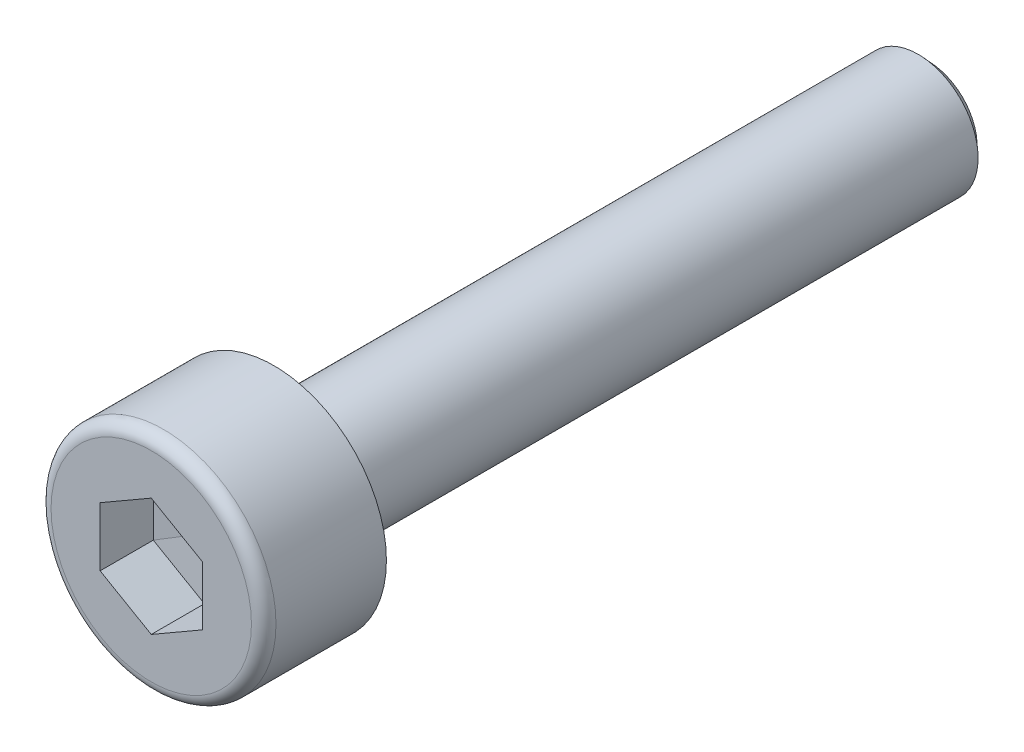
ISO-10303-21;
HEADER;
FILE_DESCRIPTION(('STEP AP214'),'2;1');
FILE_NAME('part.step','',(''),(''),'','','');
FILE_SCHEMA(('AUTOMOTIVE_DESIGN { 1 0 10303 214 1 1 1 1 }'));
ENDSEC;
DATA;
#1=APPLICATION_CONTEXT('core data for automotive mechanical design processes');
#2=APPLICATION_PROTOCOL_DEFINITION('international standard','automotive_design',2000,#1);
#3=PRODUCT_CONTEXT('',#1,'mechanical');
#4=PRODUCT('Part','Part','',(#3));
#5=PRODUCT_RELATED_PRODUCT_CATEGORY('part','',(#4));
#6=PRODUCT_DEFINITION_FORMATION('','',#4);
#7=PRODUCT_DEFINITION_CONTEXT('part definition',#1,'design');
#8=PRODUCT_DEFINITION('design','',#6,#7);
#9=PRODUCT_DEFINITION_SHAPE('','',#8);
#10=(LENGTH_UNIT() NAMED_UNIT(*) SI_UNIT(.MILLI.,.METRE.));
#11=(NAMED_UNIT(*) PLANE_ANGLE_UNIT() SI_UNIT($,.RADIAN.));
#12=(NAMED_UNIT(*) SI_UNIT($,.STERADIAN.) SOLID_ANGLE_UNIT());
#13=UNCERTAINTY_MEASURE_WITH_UNIT(LENGTH_MEASURE(1.E-05),#10,'distance_accuracy_value','');
#14=(GEOMETRIC_REPRESENTATION_CONTEXT(3) GLOBAL_UNCERTAINTY_ASSIGNED_CONTEXT((#13)) GLOBAL_UNIT_ASSIGNED_CONTEXT((#10,
#11,#12)) REPRESENTATION_CONTEXT('',''));
#15=CARTESIAN_POINT('',(0.,0.,0.));
#16=DIRECTION('',(0.,0.,1.));
#17=DIRECTION('',(1.,0.,0.));
#18=AXIS2_PLACEMENT_3D('',#15,#16,#17);
#19=CARTESIAN_POINT('',(-1.49999999999969,0.,7.91246535012183E-13));
#20=DIRECTION('',(0.,0.,-1.));
#21=DIRECTION('',(0.,-1.,0.));
#22=AXIS2_PLACEMENT_3D('',#19,#20,#21);
#23=PLANE('',#22);
#24=CARTESIAN_POINT('',(-1.15909297263707E-13,0.,8.03801469828613E-13));
#25=DIRECTION('',(0.,0.,-1.));
#26=DIRECTION('',(-1.,0.,0.));
#27=AXIS2_PLACEMENT_3D('',#24,#25,#26);
#28=CIRCLE('',#27,1.4635);
#29=CARTESIAN_POINT('',(-1.46350000000012,0.,7.91076120329944E-13));
#30=VERTEX_POINT('',#29);
#31=EDGE_CURVE('E11',#30,#30,#28,.T.);
#32=ORIENTED_EDGE('',*,*,#31,.F.);
#33=EDGE_LOOP('',(#32));
#34=FACE_BOUND('',#33,.T.);
#35=CARTESIAN_POINT('',(-1.15909297263884E-13,0.,2.21688687670205E-11));
#36=DIRECTION('',(0.,0.,-1.));
#37=DIRECTION('',(1.,0.,0.));
#38=AXIS2_PLACEMENT_3D('',#35,#36,#37);
#39=CIRCLE('',#38,2.74999999999958);
#40=CARTESIAN_POINT('',(2.74999999999946,0.,2.21917163378922E-11));
#41=VERTEX_POINT('',#40);
#42=EDGE_CURVE('E135',#41,#41,#39,.T.);
#43=ORIENTED_EDGE('',*,*,#42,.T.);
#44=EDGE_LOOP('',(#43));
#45=FACE_BOUND('',#44,.T.);
#46=ADVANCED_FACE('F17',(#34,#45),#23,.T.);
#47=CARTESIAN_POINT('',(0.,0.,-16.));
#48=DIRECTION('',(0.,0.,-1.));
#49=DIRECTION('',(0.,-1.,0.));
#50=AXIS2_PLACEMENT_3D('',#47,#48,#49);
#51=PLANE('',#50);
#52=CARTESIAN_POINT('',(0.,0.,-16.));
#53=DIRECTION('',(0.,0.,-1.));
#54=DIRECTION('',(-1.,0.,0.));
#55=AXIS2_PLACEMENT_3D('',#52,#53,#54);
#56=CIRCLE('',#55,1.193275);
#57=CARTESIAN_POINT('',(-1.193275,0.,-16.));
#58=VERTEX_POINT('',#57);
#59=EDGE_CURVE('E142',#58,#58,#56,.T.);
#60=ORIENTED_EDGE('',*,*,#59,.T.);
#61=EDGE_LOOP('',(#60));
#62=FACE_BOUND('',#61,.T.);
#63=ADVANCED_FACE('F235',(#62),#51,.T.);
#64=CARTESIAN_POINT('',(0.,0.,-7.99999999999959));
#65=DIRECTION('',(0.,0.,-1.));
#66=DIRECTION('',(-1.,0.,0.));
#67=AXIS2_PLACEMENT_3D('',#64,#65,#66);
#68=CYLINDRICAL_SURFACE('',#67,1.4635);
#69=ORIENTED_EDGE('',*,*,#31,.T.);
#70=EDGE_LOOP('',(#69));
#71=FACE_BOUND('',#70,.T.);
#72=CARTESIAN_POINT('',(0.,0.,-15.7538502839855));
#73=DIRECTION('',(0.,0.,1.));
#74=DIRECTION('',(-1.,0.,0.));
#75=AXIS2_PLACEMENT_3D('',#72,#73,#74);
#76=CIRCLE('',#75,1.4635);
#77=CARTESIAN_POINT('',(-1.46349999999998,0.,-15.7538502839855));
#78=VERTEX_POINT('',#77);
#79=EDGE_CURVE('E138',#78,#78,#76,.T.);
#80=ORIENTED_EDGE('',*,*,#79,.T.);
#81=EDGE_LOOP('',(#80));
#82=FACE_BOUND('',#81,.T.);
#83=ADVANCED_FACE('F240',(#71,#82),#68,.T.);
#84=CARTESIAN_POINT('',(0.,-1.44337567297407,3.));
#85=DIRECTION('',(-0.5,-0.866025403784438,0.));
#86=DIRECTION('',(-0.866025403784438,0.5,0.));
#87=AXIS2_PLACEMENT_3D('',#84,#85,#86);
#88=PLANE('',#87);
#89=DIRECTION('',(-0.866025403784438,0.5,0.));
#90=VECTOR('',#89,1.);
#91=CARTESIAN_POINT('',(-1.34374999999989,-0.667561248750572,3.00000000002531));
#92=LINE('',#91,#90);
#93=CARTESIAN_POINT('',(0.,-1.44337567297407,3.));
#94=VERTEX_POINT('',#93);
#95=CARTESIAN_POINT('',(-1.25,-0.721687836487033,3.));
#96=VERTEX_POINT('',#95);
#97=EDGE_CURVE('E159',#94,#96,#92,.T.);
#98=ORIENTED_EDGE('',*,*,#97,.F.);
#99=DIRECTION('',(0.,0.,-1.));
#100=VECTOR('',#99,1.);
#101=CARTESIAN_POINT('',(0.,-1.44337567297407,3.));
#102=LINE('',#101,#100);
#103=CARTESIAN_POINT('',(0.,-1.44337567297407,1.7));
#104=VERTEX_POINT('',#103);
#105=EDGE_CURVE('E105',#94,#104,#102,.T.);
#106=ORIENTED_EDGE('',*,*,#105,.T.);
#107=DIRECTION('',(-0.866025403784438,0.5,0.));
#108=VECTOR('',#107,1.);
#109=CARTESIAN_POINT('',(-1.25,-0.721687836487033,1.7));
#110=LINE('',#109,#108);
#111=CARTESIAN_POINT('',(-1.25,-0.721687836487033,1.7));
#112=VERTEX_POINT('',#111);
#113=EDGE_CURVE('E106',#104,#112,#110,.T.);
#114=ORIENTED_EDGE('',*,*,#113,.T.);
#115=DIRECTION('',(0.,0.,-1.));
#116=VECTOR('',#115,1.);
#117=CARTESIAN_POINT('',(-1.25,-0.721687836487033,3.));
#118=LINE('',#117,#116);
#119=EDGE_CURVE('E20',#96,#112,#118,.T.);
#120=ORIENTED_EDGE('',*,*,#119,.F.);
#121=EDGE_LOOP('',(#98,#106,#114,#120));
#122=FACE_BOUND('',#121,.T.);
#123=ADVANCED_FACE('F273',(#122),#88,.F.);
#124=CARTESIAN_POINT('',(-1.25,-0.721687836487033,3.));
#125=DIRECTION('',(-1.,0.,0.));
#126=DIRECTION('',(0.,0.,1.));
#127=AXIS2_PLACEMENT_3D('',#124,#125,#126);
#128=PLANE('',#127);
#129=DIRECTION('',(0.,1.,0.));
#130=VECTOR('',#129,1.);
#131=CARTESIAN_POINT('',(-1.25,-0.360843918243516,3.00000000002531));
#132=LINE('',#131,#130);
#133=CARTESIAN_POINT('',(-1.25,0.721687836487042,3.));
#134=VERTEX_POINT('',#133);
#135=EDGE_CURVE('E170',#96,#134,#132,.T.);
#136=ORIENTED_EDGE('',*,*,#135,.F.);
#137=ORIENTED_EDGE('',*,*,#119,.T.);
#138=DIRECTION('',(0.,1.,0.));
#139=VECTOR('',#138,1.);
#140=CARTESIAN_POINT('',(-1.25,0.721687836487042,1.7));
#141=LINE('',#140,#139);
#142=CARTESIAN_POINT('',(-1.25,0.721687836487042,1.7));
#143=VERTEX_POINT('',#142);
#144=EDGE_CURVE('E197',#112,#143,#141,.T.);
#145=ORIENTED_EDGE('',*,*,#144,.T.);
#146=DIRECTION('',(0.,0.,-1.));
#147=VECTOR('',#146,1.);
#148=CARTESIAN_POINT('',(-1.25,0.721687836487042,3.));
#149=LINE('',#148,#147);
#150=EDGE_CURVE('E47',#134,#143,#149,.T.);
#151=ORIENTED_EDGE('',*,*,#150,.F.);
#152=EDGE_LOOP('',(#136,#137,#145,#151));
#153=FACE_BOUND('',#152,.T.);
#154=ADVANCED_FACE('F267',(#153),#128,.F.);
#155=CARTESIAN_POINT('',(-1.25,0.721687836487042,3.));
#156=DIRECTION('',(-0.5,0.866025403784439,0.));
#157=DIRECTION('',(0.,0.,1.));
#158=AXIS2_PLACEMENT_3D('',#155,#156,#157);
#159=PLANE('',#158);
#160=DIRECTION('',(0.866025403784439,0.5,0.));
#161=VECTOR('',#160,1.);
#162=CARTESIAN_POINT('',(-1.96874999999989,0.306717330507063,3.00000000002531));
#163=LINE('',#162,#161);
#164=CARTESIAN_POINT('',(0.,1.44337567297407,3.));
#165=VERTEX_POINT('',#164);
#166=EDGE_CURVE('E151',#134,#165,#163,.T.);
#167=ORIENTED_EDGE('',*,*,#166,.F.);
#168=ORIENTED_EDGE('',*,*,#150,.T.);
#169=DIRECTION('',(0.866025403784439,0.5,0.));
#170=VECTOR('',#169,1.);
#171=CARTESIAN_POINT('',(0.,1.44337567297407,1.7));
#172=LINE('',#171,#170);
#173=CARTESIAN_POINT('',(0.,1.44337567297407,1.7));
#174=VERTEX_POINT('',#173);
#175=EDGE_CURVE('E190',#143,#174,#172,.T.);
#176=ORIENTED_EDGE('',*,*,#175,.T.);
#177=DIRECTION('',(0.,0.,-1.));
#178=VECTOR('',#177,1.);
#179=CARTESIAN_POINT('',(0.,1.44337567297407,3.));
#180=LINE('',#179,#178);
#181=EDGE_CURVE('E206',#165,#174,#180,.T.);
#182=ORIENTED_EDGE('',*,*,#181,.F.);
#183=EDGE_LOOP('',(#167,#168,#176,#182));
#184=FACE_BOUND('',#183,.T.);
#185=ADVANCED_FACE('F217',(#184),#159,.F.);
#186=CARTESIAN_POINT('',(0.,1.44337567297407,3.));
#187=DIRECTION('',(0.5,0.86602540378444,0.));
#188=DIRECTION('',(0.,0.,-1.));
#189=AXIS2_PLACEMENT_3D('',#186,#187,#188);
#190=PLANE('',#189);
#191=DIRECTION('',(0.86602540378444,-0.5,0.));
#192=VECTOR('',#191,1.);
#193=CARTESIAN_POINT('',(-0.71874999999989,1.85834617895405,3.00000000002532));
#194=LINE('',#193,#192);
#195=CARTESIAN_POINT('',(1.25000000000002,0.721687836487037,3.));
#196=VERTEX_POINT('',#195);
#197=EDGE_CURVE('E147',#165,#196,#194,.T.);
#198=ORIENTED_EDGE('',*,*,#197,.F.);
#199=ORIENTED_EDGE('',*,*,#181,.T.);
#200=DIRECTION('',(0.86602540378444,-0.5,0.));
#201=VECTOR('',#200,1.);
#202=CARTESIAN_POINT('',(1.25000000000002,0.721687836487037,1.7));
#203=LINE('',#202,#201);
#204=CARTESIAN_POINT('',(1.25000000000002,0.721687836487037,1.7));
#205=VERTEX_POINT('',#204);
#206=EDGE_CURVE('E143',#174,#205,#203,.T.);
#207=ORIENTED_EDGE('',*,*,#206,.T.);
#208=DIRECTION('',(0.,0.,-1.));
#209=VECTOR('',#208,1.);
#210=CARTESIAN_POINT('',(1.25000000000002,0.721687836487037,3.));
#211=LINE('',#210,#209);
#212=EDGE_CURVE('E112',#196,#205,#211,.T.);
#213=ORIENTED_EDGE('',*,*,#212,.F.);
#214=EDGE_LOOP('',(#198,#199,#207,#213));
#215=FACE_BOUND('',#214,.T.);
#216=ADVANCED_FACE('F213',(#215),#190,.F.);
#217=CARTESIAN_POINT('',(1.25000000000002,0.721687836487037,3.));
#218=DIRECTION('',(1.,0.,0.));
#219=DIRECTION('',(0.,1.,0.));
#220=AXIS2_PLACEMENT_3D('',#217,#218,#219);
#221=PLANE('',#220);
#222=DIRECTION('',(0.,-1.,0.));
#223=VECTOR('',#222,1.);
#224=CARTESIAN_POINT('',(1.25000000000002,0.360843918243519,3.00000000002534));
#225=LINE('',#224,#223);
#226=CARTESIAN_POINT('',(1.25000000000002,-0.721687836487035,3.));
#227=VERTEX_POINT('',#226);
#228=EDGE_CURVE('E150',#196,#227,#225,.T.);
#229=ORIENTED_EDGE('',*,*,#228,.F.);
#230=ORIENTED_EDGE('',*,*,#212,.T.);
#231=DIRECTION('',(0.,-1.,0.));
#232=VECTOR('',#231,1.);
#233=CARTESIAN_POINT('',(1.25000000000002,-0.721687836487035,1.7));
#234=LINE('',#233,#232);
#235=CARTESIAN_POINT('',(1.25000000000002,-0.721687836487035,1.7));
#236=VERTEX_POINT('',#235);
#237=EDGE_CURVE('E109',#205,#236,#234,.T.);
#238=ORIENTED_EDGE('',*,*,#237,.T.);
#239=DIRECTION('',(0.,0.,-1.));
#240=VECTOR('',#239,1.);
#241=CARTESIAN_POINT('',(1.25000000000002,-0.721687836487035,3.));
#242=LINE('',#241,#240);
#243=EDGE_CURVE('E93',#227,#236,#242,.T.);
#244=ORIENTED_EDGE('',*,*,#243,.F.);
#245=EDGE_LOOP('',(#229,#230,#238,#244));
#246=FACE_BOUND('',#245,.T.);
#247=ADVANCED_FACE('F111',(#246),#221,.F.);
#248=CARTESIAN_POINT('',(1.25000000000002,-0.721687836487035,3.));
#249=DIRECTION('',(0.5,-0.86602540378444,0.));
#250=DIRECTION('',(0.,0.,-1.));
#251=AXIS2_PLACEMENT_3D('',#248,#249,#250);
#252=PLANE('',#251);
#253=DIRECTION('',(-0.86602540378444,-0.5,0.));
#254=VECTOR('',#253,1.);
#255=CARTESIAN_POINT('',(-0.0937499999998831,-1.49750226071053,3.00000000002532));
#256=LINE('',#255,#254);
#257=EDGE_CURVE('E100',#227,#94,#256,.T.);
#258=ORIENTED_EDGE('',*,*,#257,.F.);
#259=ORIENTED_EDGE('',*,*,#243,.T.);
#260=DIRECTION('',(-0.86602540378444,-0.5,0.));
#261=VECTOR('',#260,1.);
#262=CARTESIAN_POINT('',(0.,-1.44337567297407,1.7));
#263=LINE('',#262,#261);
#264=EDGE_CURVE('E97',#236,#104,#263,.T.);
#265=ORIENTED_EDGE('',*,*,#264,.T.);
#266=ORIENTED_EDGE('',*,*,#105,.F.);
#267=EDGE_LOOP('',(#258,#259,#265,#266));
#268=FACE_BOUND('',#267,.T.);
#269=ADVANCED_FACE('F95',(#268),#252,.F.);
#270=CARTESIAN_POINT('',(-1.25,-0.721687836487033,1.7));
#271=DIRECTION('',(-0.0435778713738292,-0.0754790873051732,-0.996194698091746));
#272=DIRECTION('',(0.,-0.997141949694317,0.0755508581011304));
#273=AXIS2_PLACEMENT_3D('',#270,#271,#272);
#274=PLANE('',#273);
#275=DIRECTION('',(0.863550259614423,0.498570974847158,-0.0755508581011306));
#276=VECTOR('',#275,1.);
#277=CARTESIAN_POINT('',(-0.939283728799944,-0.542295713668082,1.67281584869695));
#278=LINE('',#277,#276);
#279=CARTESIAN_POINT('',(0.,0.,1.5906391705926));
#280=VERTEX_POINT('',#279);
#281=EDGE_CURVE('E184',#112,#280,#278,.T.);
#282=ORIENTED_EDGE('',*,*,#281,.F.);
#283=ORIENTED_EDGE('',*,*,#113,.F.);
#284=DIRECTION('',(0.,0.997141949694317,-0.0755508581011306));
#285=VECTOR('',#284,1.);
#286=CARTESIAN_POINT('',(0.,-1.08459142733617,1.67281584869695));
#287=LINE('',#286,#285);
#288=EDGE_CURVE('E128',#104,#280,#287,.T.);
#289=ORIENTED_EDGE('',*,*,#288,.T.);
#290=EDGE_LOOP('',(#282,#283,#289));
#291=FACE_BOUND('',#290,.T.);
#292=ADVANCED_FACE('F262',(#291),#274,.F.);
#293=CARTESIAN_POINT('',(-1.25,0.721687836487042,1.7));
#294=DIRECTION('',(-0.0871557427476581,0.,-0.996194698091746));
#295=DIRECTION('',(-0.996194698091746,0.,0.0871557427476581));
#296=AXIS2_PLACEMENT_3D('',#293,#294,#295);
#297=PLANE('',#296);
#298=DIRECTION('',(0.863550259614423,-0.498570974847158,-0.0755508581011305));
#299=VECTOR('',#298,1.);
#300=CARTESIAN_POINT('',(-0.939283728799944,0.542295713668093,1.67281584869695));
#301=LINE('',#300,#299);
#302=EDGE_CURVE('E193',#143,#280,#301,.T.);
#303=ORIENTED_EDGE('',*,*,#302,.F.);
#304=ORIENTED_EDGE('',*,*,#144,.F.);
#305=ORIENTED_EDGE('',*,*,#281,.T.);
#306=EDGE_LOOP('',(#303,#304,#305));
#307=FACE_BOUND('',#306,.T.);
#308=ADVANCED_FACE('F231',(#307),#297,.F.);
#309=CARTESIAN_POINT('',(0.,1.44337567297407,1.7));
#310=DIRECTION('',(-0.0435778713738291,0.0754790873051733,-0.996194698091746));
#311=DIRECTION('',(-0.999044587684655,0.,0.0437025378896691));
#312=AXIS2_PLACEMENT_3D('',#309,#310,#311);
#313=PLANE('',#312);
#314=DIRECTION('',(0.,-0.997141949694317,-0.0755508581011306));
#315=VECTOR('',#314,1.);
#316=CARTESIAN_POINT('',(0.,1.08459142733617,1.67281584869695));
#317=LINE('',#316,#315);
#318=EDGE_CURVE('E146',#174,#280,#317,.T.);
#319=ORIENTED_EDGE('',*,*,#318,.F.);
#320=ORIENTED_EDGE('',*,*,#175,.F.);
#321=ORIENTED_EDGE('',*,*,#302,.T.);
#322=EDGE_LOOP('',(#319,#320,#321));
#323=FACE_BOUND('',#322,.T.);
#324=ADVANCED_FACE('F219',(#323),#313,.F.);
#325=CARTESIAN_POINT('',(1.25000000000002,0.721687836487037,1.7));
#326=DIRECTION('',(0.0435778713738288,0.0754790873051734,-0.996194698091746));
#327=DIRECTION('',(-0.999044587684655,0.,-0.0437025378896688));
#328=AXIS2_PLACEMENT_3D('',#325,#326,#327);
#329=PLANE('',#328);
#330=DIRECTION('',(-0.863550259614422,-0.49857097484716,-0.0755508581011305));
#331=VECTOR('',#330,1.);
#332=CARTESIAN_POINT('',(0.939283728799956,0.542295713668087,1.67281584869695));
#333=LINE('',#332,#331);
#334=EDGE_CURVE('E117',#205,#280,#333,.T.);
#335=ORIENTED_EDGE('',*,*,#334,.F.);
#336=ORIENTED_EDGE('',*,*,#206,.F.);
#337=ORIENTED_EDGE('',*,*,#318,.T.);
#338=EDGE_LOOP('',(#335,#336,#337));
#339=FACE_BOUND('',#338,.T.);
#340=ADVANCED_FACE('F222',(#339),#329,.F.);
#341=CARTESIAN_POINT('',(1.25000000000002,-0.721687836487035,1.7));
#342=DIRECTION('',(0.0871557427476581,0.,-0.996194698091746));
#343=DIRECTION('',(0.,-1.,0.));
#344=AXIS2_PLACEMENT_3D('',#341,#342,#343);
#345=PLANE('',#344);
#346=DIRECTION('',(-0.863550259614422,0.49857097484716,-0.0755508581011304));
#347=VECTOR('',#346,1.);
#348=CARTESIAN_POINT('',(0.939283728799955,-0.542295713668081,1.67281584869695));
#349=LINE('',#348,#347);
#350=EDGE_CURVE('E118',#236,#280,#349,.T.);
#351=ORIENTED_EDGE('',*,*,#350,.F.);
#352=ORIENTED_EDGE('',*,*,#237,.F.);
#353=ORIENTED_EDGE('',*,*,#334,.T.);
#354=EDGE_LOOP('',(#351,#352,#353));
#355=FACE_BOUND('',#354,.T.);
#356=ADVANCED_FACE('F121',(#355),#345,.F.);
#357=CARTESIAN_POINT('',(0.,-1.44337567297407,1.7));
#358=DIRECTION('',(0.0435778713738288,-0.0754790873051735,-0.996194698091746));
#359=DIRECTION('',(0.,-0.997141949694317,0.0755508581011307));
#360=AXIS2_PLACEMENT_3D('',#357,#358,#359);
#361=PLANE('',#360);
#362=ORIENTED_EDGE('',*,*,#288,.F.);
#363=ORIENTED_EDGE('',*,*,#264,.F.);
#364=ORIENTED_EDGE('',*,*,#350,.T.);
#365=EDGE_LOOP('',(#362,#363,#364));
#366=FACE_BOUND('',#365,.T.);
#367=ADVANCED_FACE('F127',(#366),#361,.F.);
#368=CARTESIAN_POINT('',(-1.2837160864844E-13,0.,1.50000000002375));
#369=DIRECTION('',(0.,0.,-1.));
#370=DIRECTION('',(-1.,0.,0.));
#371=AXIS2_PLACEMENT_3D('',#368,#369,#370);
#372=CYLINDRICAL_SURFACE('',#371,2.74999999999957);
#373=CARTESIAN_POINT('',(-1.38341457756087E-13,0.,2.70000000002532));
#374=DIRECTION('',(0.,0.,1.));
#375=DIRECTION('',(1.,0.,0.));
#376=AXIS2_PLACEMENT_3D('',#373,#374,#375);
#377=CIRCLE('',#376,2.74999999999957);
#378=CARTESIAN_POINT('',(2.74999999999943,0.,2.70000000002534));
#379=VERTEX_POINT('',#378);
#380=EDGE_CURVE('E156',#379,#379,#377,.T.);
#381=ORIENTED_EDGE('',*,*,#380,.F.);
#382=EDGE_LOOP('',(#381));
#383=FACE_BOUND('',#382,.T.);
#384=ORIENTED_EDGE('',*,*,#42,.F.);
#385=EDGE_LOOP('',(#384));
#386=FACE_BOUND('',#385,.T.);
#387=ADVANCED_FACE('F246',(#383,#386),#372,.T.);
#388=CARTESIAN_POINT('',(-2.7499999999997,0.,3.0000000000253));
#389=DIRECTION('',(0.,0.,1.));
#390=DIRECTION('',(1.,0.,0.));
#391=AXIS2_PLACEMENT_3D('',#388,#389,#390);
#392=PLANE('',#391);
#393=ORIENTED_EDGE('',*,*,#257,.T.);
#394=ORIENTED_EDGE('',*,*,#97,.T.);
#395=ORIENTED_EDGE('',*,*,#135,.T.);
#396=ORIENTED_EDGE('',*,*,#166,.T.);
#397=ORIENTED_EDGE('',*,*,#197,.T.);
#398=ORIENTED_EDGE('',*,*,#228,.T.);
#399=EDGE_LOOP('',(#393,#394,#395,#396,#397,#398));
#400=FACE_BOUND('',#399,.T.);
#401=CARTESIAN_POINT('',(-1.40833920032996E-13,0.,3.00000000002533));
#402=DIRECTION('',(0.,0.,-1.));
#403=DIRECTION('',(1.,0.,0.));
#404=AXIS2_PLACEMENT_3D('',#401,#402,#403);
#405=CIRCLE('',#404,2.44999999999957);
#406=CARTESIAN_POINT('',(2.44999999999943,0.,3.00000000002535));
#407=VERTEX_POINT('',#406);
#408=EDGE_CURVE('E160',#407,#407,#405,.T.);
#409=ORIENTED_EDGE('',*,*,#408,.F.);
#410=EDGE_LOOP('',(#409));
#411=FACE_BOUND('',#410,.T.);
#412=ADVANCED_FACE('F248',(#400,#411),#392,.T.);
#413=CARTESIAN_POINT('',(-1.38341457756087E-13,0.,2.70000000002532));
#414=DIRECTION('',(0.,0.,-1.));
#415=DIRECTION('',(-1.,0.,0.));
#416=AXIS2_PLACEMENT_3D('',#413,#414,#415);
#417=TOROIDAL_SURFACE('',#416,2.44999999999957,0.3);
#418=ORIENTED_EDGE('',*,*,#408,.T.);
#419=EDGE_LOOP('',(#418));
#420=FACE_BOUND('',#419,.T.);
#421=ORIENTED_EDGE('',*,*,#380,.T.);
#422=EDGE_LOOP('',(#421));
#423=FACE_BOUND('',#422,.T.);
#424=ADVANCED_FACE('F255',(#420,#423),#417,.T.);
#425=CARTESIAN_POINT('',(0.,0.,-15.8466375));
#426=DIRECTION('',(0.,0.,1.));
#427=DIRECTION('',(-1.,0.,0.));
#428=AXIS2_PLACEMENT_3D('',#425,#426,#427);
#429=CONICAL_SURFACE('',#428,1.36163750000003,0.831988093683144);
#430=ORIENTED_EDGE('',*,*,#59,.F.);
#431=EDGE_LOOP('',(#430));
#432=FACE_BOUND('',#431,.T.);
#433=ORIENTED_EDGE('',*,*,#79,.F.);
#434=EDGE_LOOP('',(#433));
#435=FACE_BOUND('',#434,.T.);
#436=ADVANCED_FACE('F288',(#432,#435),#429,.T.);
#437=CLOSED_SHELL('',(#46,#63,#83,#123,#154,#185,#216,#247,#269,#292,#308,#324,#340,#356,#367,
#387,#412,#424,#436));
#438=MANIFOLD_SOLID_BREP('B1',#437);
#439=ADVANCED_BREP_SHAPE_REPRESENTATION('',(#18,#438),#14);
#440=SHAPE_DEFINITION_REPRESENTATION(#9,#439);
ENDSEC;
END-ISO-10303-21;
